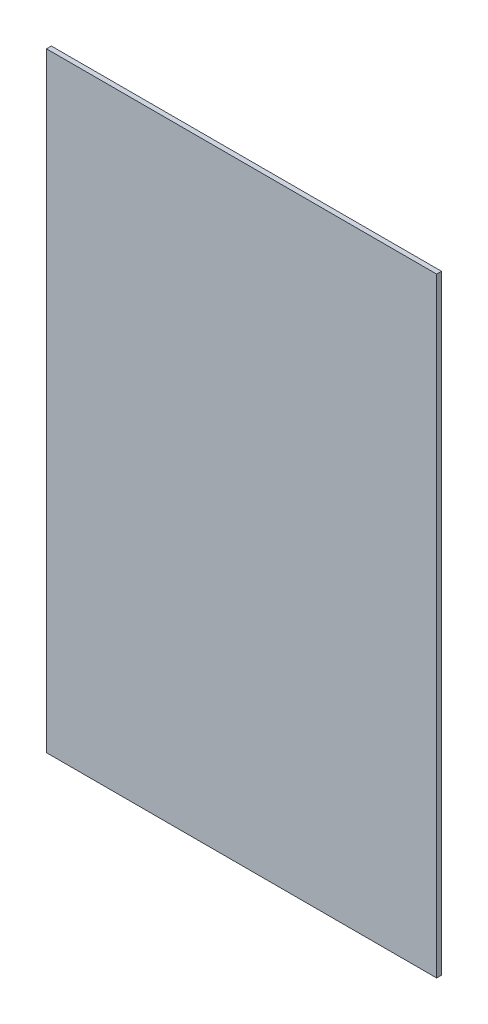
ISO-10303-21;
HEADER;
FILE_DESCRIPTION(('STEP AP214'),'2;1');
FILE_NAME('part.step','',(''),(''),'','','');
FILE_SCHEMA(('AUTOMOTIVE_DESIGN { 1 0 10303 214 1 1 1 1 }'));
ENDSEC;
DATA;
#1=APPLICATION_CONTEXT('core data for automotive mechanical design processes');
#2=APPLICATION_PROTOCOL_DEFINITION('international standard','automotive_design',2000,#1);
#3=PRODUCT_CONTEXT('',#1,'mechanical');
#4=PRODUCT('Part','Part','',(#3));
#5=PRODUCT_RELATED_PRODUCT_CATEGORY('part','',(#4));
#6=PRODUCT_DEFINITION_FORMATION('','',#4);
#7=PRODUCT_DEFINITION_CONTEXT('part definition',#1,'design');
#8=PRODUCT_DEFINITION('design','',#6,#7);
#9=PRODUCT_DEFINITION_SHAPE('','',#8);
#10=(LENGTH_UNIT() NAMED_UNIT(*) SI_UNIT(.MILLI.,.METRE.));
#11=(NAMED_UNIT(*) PLANE_ANGLE_UNIT() SI_UNIT($,.RADIAN.));
#12=(NAMED_UNIT(*) SI_UNIT($,.STERADIAN.) SOLID_ANGLE_UNIT());
#13=UNCERTAINTY_MEASURE_WITH_UNIT(LENGTH_MEASURE(1.E-05),#10,'distance_accuracy_value','');
#14=(GEOMETRIC_REPRESENTATION_CONTEXT(3) GLOBAL_UNCERTAINTY_ASSIGNED_CONTEXT((#13)) GLOBAL_UNIT_ASSIGNED_CONTEXT((#10,
#11,#12)) REPRESENTATION_CONTEXT('',''));
#15=CARTESIAN_POINT('',(0.,0.,0.));
#16=DIRECTION('',(0.,0.,1.));
#17=DIRECTION('',(1.,0.,0.));
#18=AXIS2_PLACEMENT_3D('',#15,#16,#17);
#19=CARTESIAN_POINT('',(-22.9234828496042,88.4353562005277,1.));
#20=DIRECTION('',(1.,0.,0.));
#21=DIRECTION('',(0.,1.,0.));
#22=AXIS2_PLACEMENT_3D('',#19,#20,#21);
#23=PLANE('',#22);
#24=DIRECTION('',(0.,-1.,0.));
#25=VECTOR('',#24,1.);
#26=CARTESIAN_POINT('',(-22.9234828496042,88.4353562005277,0.));
#27=LINE('',#26,#25);
#28=CARTESIAN_POINT('',(-22.9234828496042,88.4353562005277,0.));
#29=VERTEX_POINT('',#28);
#30=CARTESIAN_POINT('',(-22.9234828496042,-36.5646437994723,0.));
#31=VERTEX_POINT('',#30);
#32=EDGE_CURVE('E102',#29,#31,#27,.T.);
#33=ORIENTED_EDGE('',*,*,#32,.T.);
#34=DIRECTION('',(0.,0.,-1.));
#35=VECTOR('',#34,1.);
#36=CARTESIAN_POINT('',(-22.9234828496042,-36.5646437994723,1.));
#37=LINE('',#36,#35);
#38=CARTESIAN_POINT('',(-22.9234828496042,-36.5646437994723,1.));
#39=VERTEX_POINT('',#38);
#40=EDGE_CURVE('E11',#39,#31,#37,.T.);
#41=ORIENTED_EDGE('',*,*,#40,.F.);
#42=DIRECTION('',(0.,-1.,0.));
#43=VECTOR('',#42,1.);
#44=CARTESIAN_POINT('',(-22.9234828496042,88.4353562005277,1.));
#45=LINE('',#44,#43);
#46=CARTESIAN_POINT('',(-22.9234828496042,88.4353562005277,1.));
#47=VERTEX_POINT('',#46);
#48=EDGE_CURVE('E88',#47,#39,#45,.T.);
#49=ORIENTED_EDGE('',*,*,#48,.F.);
#50=DIRECTION('',(0.,0.,-1.));
#51=VECTOR('',#50,1.);
#52=CARTESIAN_POINT('',(-22.9234828496042,88.4353562005277,1.));
#53=LINE('',#52,#51);
#54=EDGE_CURVE('E55',#47,#29,#53,.T.);
#55=ORIENTED_EDGE('',*,*,#54,.T.);
#56=EDGE_LOOP('',(#33,#41,#49,#55));
#57=FACE_BOUND('',#56,.T.);
#58=ADVANCED_FACE('F39',(#57),#23,.F.);
#59=CARTESIAN_POINT('',(-22.9234828496042,-36.5646437994723,1.));
#60=DIRECTION('',(0.,1.,0.));
#61=DIRECTION('',(0.,0.,1.));
#62=AXIS2_PLACEMENT_3D('',#59,#60,#61);
#63=PLANE('',#62);
#64=DIRECTION('',(1.,0.,0.));
#65=VECTOR('',#64,1.);
#66=CARTESIAN_POINT('',(-22.9234828496042,-36.5646437994723,0.));
#67=LINE('',#66,#65);
#68=CARTESIAN_POINT('',(57.0765171503958,-36.5646437994723,0.));
#69=VERTEX_POINT('',#68);
#70=EDGE_CURVE('E93',#31,#69,#67,.T.);
#71=ORIENTED_EDGE('',*,*,#70,.T.);
#72=DIRECTION('',(0.,0.,-1.));
#73=VECTOR('',#72,1.);
#74=CARTESIAN_POINT('',(57.0765171503958,-36.5646437994723,1.));
#75=LINE('',#74,#73);
#76=CARTESIAN_POINT('',(57.0765171503958,-36.5646437994723,1.));
#77=VERTEX_POINT('',#76);
#78=EDGE_CURVE('E47',#77,#69,#75,.T.);
#79=ORIENTED_EDGE('',*,*,#78,.F.);
#80=DIRECTION('',(1.,0.,0.));
#81=VECTOR('',#80,1.);
#82=CARTESIAN_POINT('',(-22.9234828496042,-36.5646437994723,1.));
#83=LINE('',#82,#81);
#84=EDGE_CURVE('E80',#39,#77,#83,.T.);
#85=ORIENTED_EDGE('',*,*,#84,.F.);
#86=ORIENTED_EDGE('',*,*,#40,.T.);
#87=EDGE_LOOP('',(#71,#79,#85,#86));
#88=FACE_BOUND('',#87,.T.);
#89=ADVANCED_FACE('F92',(#88),#63,.F.);
#90=CARTESIAN_POINT('',(57.0765171503958,88.4353562005277,1.));
#91=DIRECTION('',(1.,0.,0.));
#92=DIRECTION('',(0.,1.,0.));
#93=AXIS2_PLACEMENT_3D('',#90,#91,#92);
#94=PLANE('',#93);
#95=DIRECTION('',(0.,-1.,0.));
#96=VECTOR('',#95,1.);
#97=CARTESIAN_POINT('',(57.0765171503958,88.4353562005277,0.));
#98=LINE('',#97,#96);
#99=CARTESIAN_POINT('',(57.0765171503958,88.4353562005277,0.));
#100=VERTEX_POINT('',#99);
#101=EDGE_CURVE('E105',#100,#69,#98,.T.);
#102=ORIENTED_EDGE('',*,*,#101,.F.);
#103=DIRECTION('',(0.,0.,-1.));
#104=VECTOR('',#103,1.);
#105=CARTESIAN_POINT('',(57.0765171503958,88.4353562005277,1.));
#106=LINE('',#105,#104);
#107=CARTESIAN_POINT('',(57.0765171503958,88.4353562005277,1.));
#108=VERTEX_POINT('',#107);
#109=EDGE_CURVE('E69',#108,#100,#106,.T.);
#110=ORIENTED_EDGE('',*,*,#109,.F.);
#111=DIRECTION('',(0.,-1.,0.));
#112=VECTOR('',#111,1.);
#113=CARTESIAN_POINT('',(57.0765171503958,88.4353562005277,1.));
#114=LINE('',#113,#112);
#115=EDGE_CURVE('E87',#108,#77,#114,.T.);
#116=ORIENTED_EDGE('',*,*,#115,.T.);
#117=ORIENTED_EDGE('',*,*,#78,.T.);
#118=EDGE_LOOP('',(#102,#110,#116,#117));
#119=FACE_BOUND('',#118,.T.);
#120=ADVANCED_FACE('F96',(#119),#94,.T.);
#121=CARTESIAN_POINT('',(-22.9234828496042,88.4353562005277,1.));
#122=DIRECTION('',(0.,1.,0.));
#123=DIRECTION('',(0.,0.,1.));
#124=AXIS2_PLACEMENT_3D('',#121,#122,#123);
#125=PLANE('',#124);
#126=DIRECTION('',(1.,0.,0.));
#127=VECTOR('',#126,1.);
#128=CARTESIAN_POINT('',(-22.9234828496042,88.4353562005277,0.));
#129=LINE('',#128,#127);
#130=EDGE_CURVE('E107',#29,#100,#129,.T.);
#131=ORIENTED_EDGE('',*,*,#130,.F.);
#132=ORIENTED_EDGE('',*,*,#54,.F.);
#133=DIRECTION('',(1.,0.,0.));
#134=VECTOR('',#133,1.);
#135=CARTESIAN_POINT('',(-22.9234828496042,88.4353562005277,1.));
#136=LINE('',#135,#134);
#137=EDGE_CURVE('E97',#47,#108,#136,.T.);
#138=ORIENTED_EDGE('',*,*,#137,.T.);
#139=ORIENTED_EDGE('',*,*,#109,.T.);
#140=EDGE_LOOP('',(#131,#132,#138,#139));
#141=FACE_BOUND('',#140,.T.);
#142=ADVANCED_FACE('F113',(#141),#125,.T.);
#143=CARTESIAN_POINT('',(0.,0.,1.));
#144=DIRECTION('',(0.,0.,1.));
#145=DIRECTION('',(1.,0.,0.));
#146=AXIS2_PLACEMENT_3D('',#143,#144,#145);
#147=PLANE('',#146);
#148=ORIENTED_EDGE('',*,*,#48,.T.);
#149=ORIENTED_EDGE('',*,*,#84,.T.);
#150=ORIENTED_EDGE('',*,*,#115,.F.);
#151=ORIENTED_EDGE('',*,*,#137,.F.);
#152=EDGE_LOOP('',(#148,#149,#150,#151));
#153=FACE_BOUND('',#152,.T.);
#154=ADVANCED_FACE('F84',(#153),#147,.T.);
#155=CARTESIAN_POINT('',(0.,0.,0.));
#156=DIRECTION('',(0.,0.,1.));
#157=DIRECTION('',(1.,0.,0.));
#158=AXIS2_PLACEMENT_3D('',#155,#156,#157);
#159=PLANE('',#158);
#160=ORIENTED_EDGE('',*,*,#32,.F.);
#161=ORIENTED_EDGE('',*,*,#130,.T.);
#162=ORIENTED_EDGE('',*,*,#101,.T.);
#163=ORIENTED_EDGE('',*,*,#70,.F.);
#164=EDGE_LOOP('',(#160,#161,#162,#163));
#165=FACE_BOUND('',#164,.T.);
#166=ADVANCED_FACE('F112',(#165),#159,.F.);
#167=CLOSED_SHELL('',(#58,#89,#120,#142,#154,#166));
#168=MANIFOLD_SOLID_BREP('B2',#167);
#169=ADVANCED_BREP_SHAPE_REPRESENTATION('',(#18,#168),#14);
#170=SHAPE_DEFINITION_REPRESENTATION(#9,#169);
ENDSEC;
END-ISO-10303-21;
